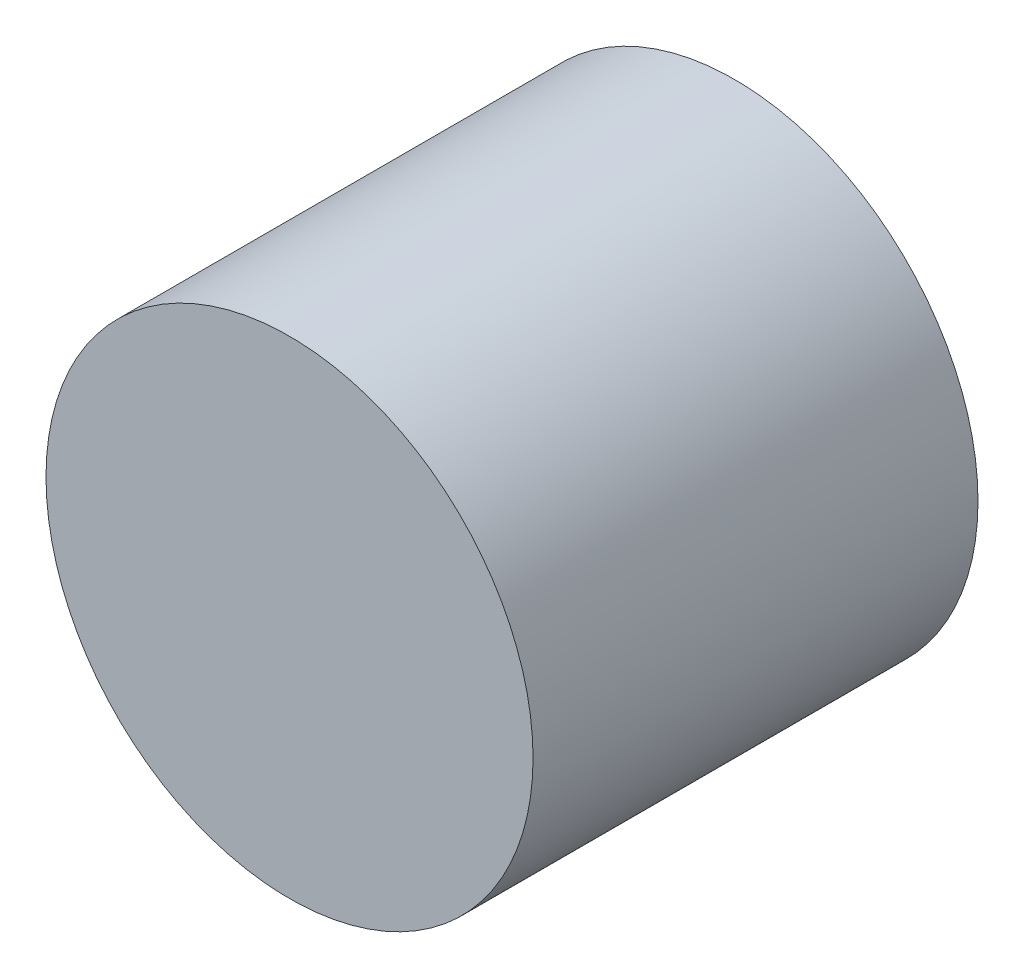
ISO-10303-21;
HEADER;
FILE_DESCRIPTION(('STEP AP214'),'2;1');
FILE_NAME('part.step','',(''),(''),'','','');
FILE_SCHEMA(('AUTOMOTIVE_DESIGN { 1 0 10303 214 1 1 1 1 }'));
ENDSEC;
DATA;
#1=APPLICATION_CONTEXT('core data for automotive mechanical design processes');
#2=APPLICATION_PROTOCOL_DEFINITION('international standard','automotive_design',2000,#1);
#3=PRODUCT_CONTEXT('',#1,'mechanical');
#4=PRODUCT('Part','Part','',(#3));
#5=PRODUCT_RELATED_PRODUCT_CATEGORY('part','',(#4));
#6=PRODUCT_DEFINITION_FORMATION('','',#4);
#7=PRODUCT_DEFINITION_CONTEXT('part definition',#1,'design');
#8=PRODUCT_DEFINITION('design','',#6,#7);
#9=PRODUCT_DEFINITION_SHAPE('','',#8);
#10=(LENGTH_UNIT() NAMED_UNIT(*) SI_UNIT(.MILLI.,.METRE.));
#11=(NAMED_UNIT(*) PLANE_ANGLE_UNIT() SI_UNIT($,.RADIAN.));
#12=(NAMED_UNIT(*) SI_UNIT($,.STERADIAN.) SOLID_ANGLE_UNIT());
#13=UNCERTAINTY_MEASURE_WITH_UNIT(LENGTH_MEASURE(1.E-05),#10,'distance_accuracy_value','');
#14=(GEOMETRIC_REPRESENTATION_CONTEXT(3) GLOBAL_UNCERTAINTY_ASSIGNED_CONTEXT((#13)) GLOBAL_UNIT_ASSIGNED_CONTEXT((#10,
#11,#12)) REPRESENTATION_CONTEXT('',''));
#15=CARTESIAN_POINT('',(0.,0.,0.));
#16=DIRECTION('',(0.,0.,1.));
#17=DIRECTION('',(1.,0.,0.));
#18=AXIS2_PLACEMENT_3D('',#15,#16,#17);
#19=CARTESIAN_POINT('',(0.,0.,50.8));
#20=DIRECTION('',(0.,0.,-1.));
#21=DIRECTION('',(-1.,0.,0.));
#22=AXIS2_PLACEMENT_3D('',#19,#20,#21);
#23=CYLINDRICAL_SURFACE('',#22,27.8041508418893);
#24=CARTESIAN_POINT('',(0.,0.,50.8));
#25=DIRECTION('',(0.,0.,1.));
#26=DIRECTION('',(1.,0.,0.));
#27=AXIS2_PLACEMENT_3D('',#24,#25,#26);
#28=CIRCLE('',#27,27.8041508418893);
#29=CARTESIAN_POINT('',(27.8041508418893,0.,50.8));
#30=VERTEX_POINT('',#29);
#31=EDGE_CURVE('E10',#30,#30,#28,.T.);
#32=ORIENTED_EDGE('',*,*,#31,.F.);
#33=EDGE_LOOP('',(#32));
#34=FACE_BOUND('',#33,.T.);
#35=CARTESIAN_POINT('',(0.,0.,0.));
#36=DIRECTION('',(0.,0.,1.));
#37=DIRECTION('',(1.,0.,0.));
#38=AXIS2_PLACEMENT_3D('',#35,#36,#37);
#39=CIRCLE('',#38,27.8041508418893);
#40=CARTESIAN_POINT('',(27.8041508418893,0.,0.));
#41=VERTEX_POINT('',#40);
#42=EDGE_CURVE('E33',#41,#41,#39,.T.);
#43=ORIENTED_EDGE('',*,*,#42,.T.);
#44=EDGE_LOOP('',(#43));
#45=FACE_BOUND('',#44,.T.);
#46=ADVANCED_FACE('F27',(#34,#45),#23,.T.);
#47=CARTESIAN_POINT('',(0.,0.,50.8));
#48=DIRECTION('',(0.,0.,1.));
#49=DIRECTION('',(1.,0.,0.));
#50=AXIS2_PLACEMENT_3D('',#47,#48,#49);
#51=PLANE('',#50);
#52=ORIENTED_EDGE('',*,*,#31,.T.);
#53=EDGE_LOOP('',(#52));
#54=FACE_BOUND('',#53,.T.);
#55=ADVANCED_FACE('F42',(#54),#51,.T.);
#56=CARTESIAN_POINT('',(0.,0.,0.));
#57=DIRECTION('',(0.,0.,1.));
#58=DIRECTION('',(1.,0.,0.));
#59=AXIS2_PLACEMENT_3D('',#56,#57,#58);
#60=PLANE('',#59);
#61=ORIENTED_EDGE('',*,*,#42,.F.);
#62=EDGE_LOOP('',(#61));
#63=FACE_BOUND('',#62,.T.);
#64=ADVANCED_FACE('F40',(#63),#60,.F.);
#65=CLOSED_SHELL('',(#46,#55,#64));
#66=MANIFOLD_SOLID_BREP('B2',#65);
#67=ADVANCED_BREP_SHAPE_REPRESENTATION('',(#18,#66),#14);
#68=SHAPE_DEFINITION_REPRESENTATION(#9,#67);
ENDSEC;
END-ISO-10303-21;
